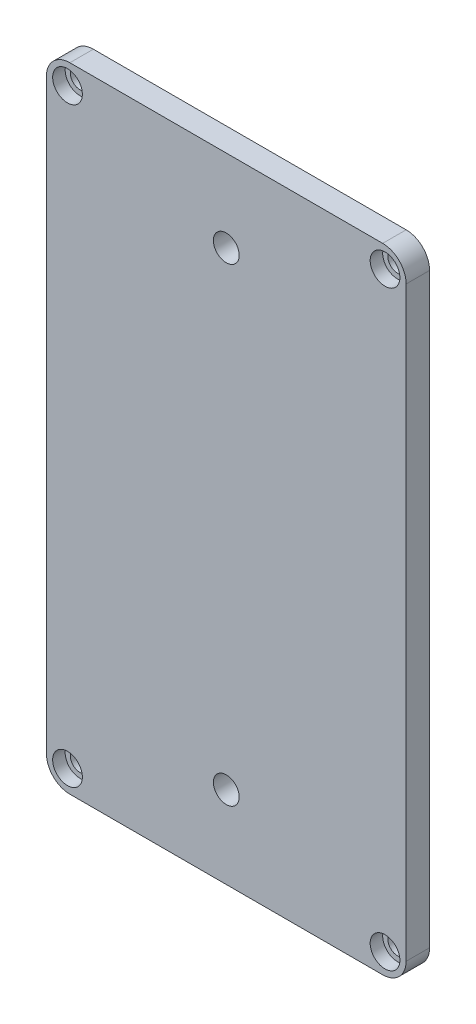
ISO-10303-21;
HEADER;
FILE_DESCRIPTION(('STEP AP214'),'2;1');
FILE_NAME('part.step','',(''),(''),'','','');
FILE_SCHEMA(('AUTOMOTIVE_DESIGN { 1 0 10303 214 1 1 1 1 }'));
ENDSEC;
DATA;
#1=APPLICATION_CONTEXT('core data for automotive mechanical design processes');
#2=APPLICATION_PROTOCOL_DEFINITION('international standard','automotive_design',2000,#1);
#3=PRODUCT_CONTEXT('',#1,'mechanical');
#4=PRODUCT('Part','Part','',(#3));
#5=PRODUCT_RELATED_PRODUCT_CATEGORY('part','',(#4));
#6=PRODUCT_DEFINITION_FORMATION('','',#4);
#7=PRODUCT_DEFINITION_CONTEXT('part definition',#1,'design');
#8=PRODUCT_DEFINITION('design','',#6,#7);
#9=PRODUCT_DEFINITION_SHAPE('','',#8);
#10=(LENGTH_UNIT() NAMED_UNIT(*) SI_UNIT(.MILLI.,.METRE.));
#11=(NAMED_UNIT(*) PLANE_ANGLE_UNIT() SI_UNIT($,.RADIAN.));
#12=(NAMED_UNIT(*) SI_UNIT($,.STERADIAN.) SOLID_ANGLE_UNIT());
#13=UNCERTAINTY_MEASURE_WITH_UNIT(LENGTH_MEASURE(1.E-05),#10,'distance_accuracy_value','');
#14=(GEOMETRIC_REPRESENTATION_CONTEXT(3) GLOBAL_UNCERTAINTY_ASSIGNED_CONTEXT((#13)) GLOBAL_UNIT_ASSIGNED_CONTEXT((#10,
#11,#12)) REPRESENTATION_CONTEXT('',''));
#15=CARTESIAN_POINT('',(0.,0.,0.));
#16=DIRECTION('',(0.,0.,1.));
#17=DIRECTION('',(1.,0.,0.));
#18=AXIS2_PLACEMENT_3D('',#15,#16,#17);
#19=CARTESIAN_POINT('',(20.3,37.8,3.));
#20=DIRECTION('',(0.,0.,-1.));
#21=DIRECTION('',(-1.,0.,0.));
#22=AXIS2_PLACEMENT_3D('',#19,#20,#21);
#23=CYLINDRICAL_SURFACE('',#22,1.25);
#24=CARTESIAN_POINT('',(20.3,37.8,0.));
#25=DIRECTION('',(0.,0.,1.));
#26=DIRECTION('',(-1.,0.,0.));
#27=AXIS2_PLACEMENT_3D('',#24,#25,#26);
#28=CIRCLE('',#27,1.25);
#29=CARTESIAN_POINT('',(19.05,37.8,0.));
#30=VERTEX_POINT('',#29);
#31=EDGE_CURVE('E140',#30,#30,#28,.T.);
#32=ORIENTED_EDGE('',*,*,#31,.F.);
#33=EDGE_LOOP('',(#32));
#34=FACE_BOUND('',#33,.T.);
#35=CARTESIAN_POINT('',(20.3,37.8,1.4));
#36=DIRECTION('',(0.,0.,1.));
#37=DIRECTION('',(1.,0.,0.));
#38=AXIS2_PLACEMENT_3D('',#35,#36,#37);
#39=CIRCLE('',#38,1.25);
#40=CARTESIAN_POINT('',(21.55,37.8,1.4));
#41=VERTEX_POINT('',#40);
#42=EDGE_CURVE('E175',#41,#41,#39,.T.);
#43=ORIENTED_EDGE('',*,*,#42,.T.);
#44=EDGE_LOOP('',(#43));
#45=FACE_BOUND('',#44,.T.);
#46=ADVANCED_FACE('F36',(#34,#45),#23,.F.);
#47=CARTESIAN_POINT('',(-20.3,-37.8,3.));
#48=DIRECTION('',(0.,0.,-1.));
#49=DIRECTION('',(-1.,0.,0.));
#50=AXIS2_PLACEMENT_3D('',#47,#48,#49);
#51=CYLINDRICAL_SURFACE('',#50,1.25);
#52=CARTESIAN_POINT('',(-20.3,-37.8,0.));
#53=DIRECTION('',(0.,0.,1.));
#54=DIRECTION('',(-1.,0.,0.));
#55=AXIS2_PLACEMENT_3D('',#52,#53,#54);
#56=CIRCLE('',#55,1.25);
#57=CARTESIAN_POINT('',(-21.55,-37.8,0.));
#58=VERTEX_POINT('',#57);
#59=EDGE_CURVE('E180',#58,#58,#56,.T.);
#60=ORIENTED_EDGE('',*,*,#59,.F.);
#61=EDGE_LOOP('',(#60));
#62=FACE_BOUND('',#61,.T.);
#63=CARTESIAN_POINT('',(-20.3,-37.8,1.4));
#64=DIRECTION('',(0.,0.,1.));
#65=DIRECTION('',(1.,0.,0.));
#66=AXIS2_PLACEMENT_3D('',#63,#64,#65);
#67=CIRCLE('',#66,1.25);
#68=CARTESIAN_POINT('',(-19.05,-37.8,1.4));
#69=VERTEX_POINT('',#68);
#70=EDGE_CURVE('E168',#69,#69,#67,.T.);
#71=ORIENTED_EDGE('',*,*,#70,.T.);
#72=EDGE_LOOP('',(#71));
#73=FACE_BOUND('',#72,.T.);
#74=ADVANCED_FACE('F257',(#62,#73),#51,.F.);
#75=CARTESIAN_POINT('',(0.,0.,3.));
#76=DIRECTION('',(0.,0.,-1.));
#77=DIRECTION('',(-1.,0.,0.));
#78=AXIS2_PLACEMENT_3D('',#75,#76,#77);
#79=PLANE('',#78);
#80=CARTESIAN_POINT('',(0.,30.,3.));
#81=DIRECTION('',(0.,0.,1.));
#82=DIRECTION('',(1.,0.,0.));
#83=AXIS2_PLACEMENT_3D('',#80,#81,#82);
#84=CIRCLE('',#83,1.65);
#85=CARTESIAN_POINT('',(1.65,30.,3.));
#86=VERTEX_POINT('',#85);
#87=EDGE_CURVE('E183',#86,#86,#84,.T.);
#88=ORIENTED_EDGE('',*,*,#87,.F.);
#89=EDGE_LOOP('',(#88));
#90=FACE_BOUND('',#89,.T.);
#91=CARTESIAN_POINT('',(0.,-30.,3.));
#92=DIRECTION('',(0.,0.,1.));
#93=DIRECTION('',(-1.,0.,0.));
#94=AXIS2_PLACEMENT_3D('',#91,#92,#93);
#95=CIRCLE('',#94,1.65);
#96=CARTESIAN_POINT('',(-1.64999999999999,-30.,3.));
#97=VERTEX_POINT('',#96);
#98=EDGE_CURVE('E189',#97,#97,#95,.T.);
#99=ORIENTED_EDGE('',*,*,#98,.F.);
#100=EDGE_LOOP('',(#99));
#101=FACE_BOUND('',#100,.T.);
#102=CARTESIAN_POINT('',(20.3,-37.8,3.));
#103=DIRECTION('',(0.,0.,1.));
#104=DIRECTION('',(-1.,0.,0.));
#105=AXIS2_PLACEMENT_3D('',#102,#103,#104);
#106=CIRCLE('',#105,1.9);
#107=CARTESIAN_POINT('',(18.4,-37.8,3.));
#108=VERTEX_POINT('',#107);
#109=EDGE_CURVE('E187',#108,#108,#106,.T.);
#110=ORIENTED_EDGE('',*,*,#109,.F.);
#111=EDGE_LOOP('',(#110));
#112=FACE_BOUND('',#111,.T.);
#113=CARTESIAN_POINT('',(-20.3,-37.8,3.));
#114=DIRECTION('',(0.,0.,1.));
#115=DIRECTION('',(1.,0.,0.));
#116=AXIS2_PLACEMENT_3D('',#113,#114,#115);
#117=CIRCLE('',#116,1.9);
#118=CARTESIAN_POINT('',(-18.4,-37.8,3.));
#119=VERTEX_POINT('',#118);
#120=EDGE_CURVE('E206',#119,#119,#117,.T.);
#121=ORIENTED_EDGE('',*,*,#120,.F.);
#122=EDGE_LOOP('',(#121));
#123=FACE_BOUND('',#122,.T.);
#124=CARTESIAN_POINT('',(-20.3,37.8,3.));
#125=DIRECTION('',(0.,0.,1.));
#126=DIRECTION('',(-1.,0.,0.));
#127=AXIS2_PLACEMENT_3D('',#124,#125,#126);
#128=CIRCLE('',#127,1.9);
#129=CARTESIAN_POINT('',(-22.2,37.8,3.));
#130=VERTEX_POINT('',#129);
#131=EDGE_CURVE('E200',#130,#130,#128,.T.);
#132=ORIENTED_EDGE('',*,*,#131,.F.);
#133=EDGE_LOOP('',(#132));
#134=FACE_BOUND('',#133,.T.);
#135=CARTESIAN_POINT('',(20.3,37.8,3.));
#136=DIRECTION('',(0.,0.,1.));
#137=DIRECTION('',(1.,0.,0.));
#138=AXIS2_PLACEMENT_3D('',#135,#136,#137);
#139=CIRCLE('',#138,1.9);
#140=CARTESIAN_POINT('',(22.2,37.8,3.));
#141=VERTEX_POINT('',#140);
#142=EDGE_CURVE('E199',#141,#141,#139,.T.);
#143=ORIENTED_EDGE('',*,*,#142,.F.);
#144=EDGE_LOOP('',(#143));
#145=FACE_BOUND('',#144,.T.);
#146=DIRECTION('',(1.,0.,0.));
#147=VECTOR('',#146,1.);
#148=CARTESIAN_POINT('',(-23.,-40.5,3.));
#149=LINE('',#148,#147);
#150=CARTESIAN_POINT('',(-20.,-40.5,3.));
#151=VERTEX_POINT('',#150);
#152=CARTESIAN_POINT('',(20.,-40.5,3.));
#153=VERTEX_POINT('',#152);
#154=EDGE_CURVE('E143',#151,#153,#149,.T.);
#155=ORIENTED_EDGE('',*,*,#154,.T.);
#156=CARTESIAN_POINT('',(20.,-37.5,3.));
#157=DIRECTION('',(0.,0.,-1.));
#158=DIRECTION('',(-1.,0.,0.));
#159=AXIS2_PLACEMENT_3D('',#156,#157,#158);
#160=CIRCLE('',#159,3.);
#161=CARTESIAN_POINT('',(23.,-37.5,3.));
#162=VERTEX_POINT('',#161);
#163=EDGE_CURVE('E161',#153,#162,#160,.F.);
#164=ORIENTED_EDGE('',*,*,#163,.T.);
#165=DIRECTION('',(0.,1.,0.));
#166=VECTOR('',#165,1.);
#167=CARTESIAN_POINT('',(23.,-40.5,3.));
#168=LINE('',#167,#166);
#169=CARTESIAN_POINT('',(23.,37.5,3.));
#170=VERTEX_POINT('',#169);
#171=EDGE_CURVE('E125',#162,#170,#168,.T.);
#172=ORIENTED_EDGE('',*,*,#171,.T.);
#173=CARTESIAN_POINT('',(20.,37.5,3.));
#174=DIRECTION('',(0.,0.,-1.));
#175=DIRECTION('',(-1.,0.,0.));
#176=AXIS2_PLACEMENT_3D('',#173,#174,#175);
#177=CIRCLE('',#176,3.);
#178=CARTESIAN_POINT('',(20.,40.5,3.));
#179=VERTEX_POINT('',#178);
#180=EDGE_CURVE('E157',#170,#179,#177,.F.);
#181=ORIENTED_EDGE('',*,*,#180,.T.);
#182=DIRECTION('',(-1.,0.,0.));
#183=VECTOR('',#182,1.);
#184=CARTESIAN_POINT('',(-23.,40.5,3.));
#185=LINE('',#184,#183);
#186=CARTESIAN_POINT('',(-20.,40.5,3.));
#187=VERTEX_POINT('',#186);
#188=EDGE_CURVE('E226',#179,#187,#185,.T.);
#189=ORIENTED_EDGE('',*,*,#188,.T.);
#190=CARTESIAN_POINT('',(-20.,37.5,3.));
#191=DIRECTION('',(0.,0.,-1.));
#192=DIRECTION('',(-1.,0.,0.));
#193=AXIS2_PLACEMENT_3D('',#190,#191,#192);
#194=CIRCLE('',#193,3.);
#195=CARTESIAN_POINT('',(-23.,37.5,3.));
#196=VERTEX_POINT('',#195);
#197=EDGE_CURVE('E60',#187,#196,#194,.F.);
#198=ORIENTED_EDGE('',*,*,#197,.T.);
#199=DIRECTION('',(0.,-1.,0.));
#200=VECTOR('',#199,1.);
#201=CARTESIAN_POINT('',(-23.,-40.5,3.));
#202=LINE('',#201,#200);
#203=CARTESIAN_POINT('',(-23.,-37.5,3.));
#204=VERTEX_POINT('',#203);
#205=EDGE_CURVE('E227',#196,#204,#202,.T.);
#206=ORIENTED_EDGE('',*,*,#205,.T.);
#207=CARTESIAN_POINT('',(-20.,-37.5,3.));
#208=DIRECTION('',(0.,0.,-1.));
#209=DIRECTION('',(-1.,0.,0.));
#210=AXIS2_PLACEMENT_3D('',#207,#208,#209);
#211=CIRCLE('',#210,3.);
#212=EDGE_CURVE('E159',#204,#151,#211,.F.);
#213=ORIENTED_EDGE('',*,*,#212,.T.);
#214=EDGE_LOOP('',(#155,#164,#172,#181,#189,#198,#206,#213));
#215=FACE_BOUND('',#214,.T.);
#216=ADVANCED_FACE('F231',(#90,#101,#112,#123,#134,#145,#215),#79,.F.);
#217=CARTESIAN_POINT('',(0.,0.,0.));
#218=DIRECTION('',(0.,0.,-1.));
#219=DIRECTION('',(-1.,0.,0.));
#220=AXIS2_PLACEMENT_3D('',#217,#218,#219);
#221=PLANE('',#220);
#222=CARTESIAN_POINT('',(0.,30.,0.));
#223=DIRECTION('',(0.,0.,-1.));
#224=DIRECTION('',(-1.,0.,0.));
#225=AXIS2_PLACEMENT_3D('',#222,#223,#224);
#226=CIRCLE('',#225,1.65);
#227=CARTESIAN_POINT('',(-1.65,30.,0.));
#228=VERTEX_POINT('',#227);
#229=EDGE_CURVE('E40',#228,#228,#226,.T.);
#230=ORIENTED_EDGE('',*,*,#229,.F.);
#231=EDGE_LOOP('',(#230));
#232=FACE_BOUND('',#231,.T.);
#233=CARTESIAN_POINT('',(0.,-30.,0.));
#234=DIRECTION('',(0.,0.,-1.));
#235=DIRECTION('',(-1.,0.,0.));
#236=AXIS2_PLACEMENT_3D('',#233,#234,#235);
#237=CIRCLE('',#236,1.65);
#238=CARTESIAN_POINT('',(-1.64999999999999,-30.,0.));
#239=VERTEX_POINT('',#238);
#240=EDGE_CURVE('E181',#239,#239,#237,.T.);
#241=ORIENTED_EDGE('',*,*,#240,.F.);
#242=EDGE_LOOP('',(#241));
#243=FACE_BOUND('',#242,.T.);
#244=CARTESIAN_POINT('',(20.3,-37.8,0.));
#245=DIRECTION('',(0.,0.,1.));
#246=DIRECTION('',(1.,0.,0.));
#247=AXIS2_PLACEMENT_3D('',#244,#245,#246);
#248=CIRCLE('',#247,1.25);
#249=CARTESIAN_POINT('',(21.55,-37.8,0.));
#250=VERTEX_POINT('',#249);
#251=EDGE_CURVE('E220',#250,#250,#248,.T.);
#252=ORIENTED_EDGE('',*,*,#251,.T.);
#253=EDGE_LOOP('',(#252));
#254=FACE_BOUND('',#253,.T.);
#255=CARTESIAN_POINT('',(-20.3,37.8,0.));
#256=DIRECTION('',(0.,0.,1.));
#257=DIRECTION('',(1.,0.,0.));
#258=AXIS2_PLACEMENT_3D('',#255,#256,#257);
#259=CIRCLE('',#258,1.25);
#260=CARTESIAN_POINT('',(-19.05,37.8,0.));
#261=VERTEX_POINT('',#260);
#262=EDGE_CURVE('E134',#261,#261,#259,.T.);
#263=ORIENTED_EDGE('',*,*,#262,.T.);
#264=EDGE_LOOP('',(#263));
#265=FACE_BOUND('',#264,.T.);
#266=DIRECTION('',(0.,1.,0.));
#267=VECTOR('',#266,1.);
#268=CARTESIAN_POINT('',(23.,-40.5,0.));
#269=LINE('',#268,#267);
#270=CARTESIAN_POINT('',(23.,-37.5,0.));
#271=VERTEX_POINT('',#270);
#272=CARTESIAN_POINT('',(23.,37.5,0.));
#273=VERTEX_POINT('',#272);
#274=EDGE_CURVE('E122',#271,#273,#269,.T.);
#275=ORIENTED_EDGE('',*,*,#274,.F.);
#276=CARTESIAN_POINT('',(20.,-37.5,0.));
#277=DIRECTION('',(0.,0.,-1.));
#278=DIRECTION('',(-1.,0.,0.));
#279=AXIS2_PLACEMENT_3D('',#276,#277,#278);
#280=CIRCLE('',#279,3.);
#281=CARTESIAN_POINT('',(20.,-40.5,0.));
#282=VERTEX_POINT('',#281);
#283=EDGE_CURVE('E105',#271,#282,#280,.T.);
#284=ORIENTED_EDGE('',*,*,#283,.T.);
#285=DIRECTION('',(1.,0.,0.));
#286=VECTOR('',#285,1.);
#287=CARTESIAN_POINT('',(-23.,-40.5,0.));
#288=LINE('',#287,#286);
#289=CARTESIAN_POINT('',(-20.,-40.5,0.));
#290=VERTEX_POINT('',#289);
#291=EDGE_CURVE('E147',#290,#282,#288,.T.);
#292=ORIENTED_EDGE('',*,*,#291,.F.);
#293=CARTESIAN_POINT('',(-20.,-37.5,0.));
#294=DIRECTION('',(0.,0.,-1.));
#295=DIRECTION('',(-1.,0.,0.));
#296=AXIS2_PLACEMENT_3D('',#293,#294,#295);
#297=CIRCLE('',#296,3.);
#298=CARTESIAN_POINT('',(-23.,-37.5,0.));
#299=VERTEX_POINT('',#298);
#300=EDGE_CURVE('E116',#290,#299,#297,.T.);
#301=ORIENTED_EDGE('',*,*,#300,.T.);
#302=DIRECTION('',(0.,-1.,0.));
#303=VECTOR('',#302,1.);
#304=CARTESIAN_POINT('',(-23.,-40.5,0.));
#305=LINE('',#304,#303);
#306=CARTESIAN_POINT('',(-23.,37.5,0.));
#307=VERTEX_POINT('',#306);
#308=EDGE_CURVE('E137',#307,#299,#305,.T.);
#309=ORIENTED_EDGE('',*,*,#308,.F.);
#310=CARTESIAN_POINT('',(-20.,37.5,0.));
#311=DIRECTION('',(0.,0.,-1.));
#312=DIRECTION('',(-1.,0.,0.));
#313=AXIS2_PLACEMENT_3D('',#310,#311,#312);
#314=CIRCLE('',#313,3.);
#315=CARTESIAN_POINT('',(-20.,40.5,0.));
#316=VERTEX_POINT('',#315);
#317=EDGE_CURVE('E126',#307,#316,#314,.T.);
#318=ORIENTED_EDGE('',*,*,#317,.T.);
#319=DIRECTION('',(-1.,0.,0.));
#320=VECTOR('',#319,1.);
#321=CARTESIAN_POINT('',(-23.,40.5,0.));
#322=LINE('',#321,#320);
#323=CARTESIAN_POINT('',(20.,40.5,0.));
#324=VERTEX_POINT('',#323);
#325=EDGE_CURVE('E133',#324,#316,#322,.T.);
#326=ORIENTED_EDGE('',*,*,#325,.F.);
#327=CARTESIAN_POINT('',(20.,37.5,0.));
#328=DIRECTION('',(0.,0.,-1.));
#329=DIRECTION('',(-1.,0.,0.));
#330=AXIS2_PLACEMENT_3D('',#327,#328,#329);
#331=CIRCLE('',#330,3.);
#332=EDGE_CURVE('E132',#324,#273,#331,.T.);
#333=ORIENTED_EDGE('',*,*,#332,.T.);
#334=EDGE_LOOP('',(#275,#284,#292,#301,#309,#318,#326,#333));
#335=FACE_BOUND('',#334,.T.);
#336=ORIENTED_EDGE('',*,*,#31,.T.);
#337=EDGE_LOOP('',(#336));
#338=FACE_BOUND('',#337,.T.);
#339=ORIENTED_EDGE('',*,*,#59,.T.);
#340=EDGE_LOOP('',(#339));
#341=FACE_BOUND('',#340,.T.);
#342=ADVANCED_FACE('F129',(#232,#243,#254,#265,#335,#338,#341),#221,.T.);
#343=CARTESIAN_POINT('',(23.,-40.5,3.));
#344=DIRECTION('',(-1.,0.,0.));
#345=DIRECTION('',(0.,0.,1.));
#346=AXIS2_PLACEMENT_3D('',#343,#344,#345);
#347=PLANE('',#346);
#348=ORIENTED_EDGE('',*,*,#171,.F.);
#349=DIRECTION('',(0.,0.,-1.));
#350=VECTOR('',#349,1.);
#351=CARTESIAN_POINT('',(23.,-37.5,3.));
#352=LINE('',#351,#350);
#353=EDGE_CURVE('E109',#162,#271,#352,.T.);
#354=ORIENTED_EDGE('',*,*,#353,.T.);
#355=ORIENTED_EDGE('',*,*,#274,.T.);
#356=DIRECTION('',(0.,0.,-1.));
#357=VECTOR('',#356,1.);
#358=CARTESIAN_POINT('',(23.,37.5,3.));
#359=LINE('',#358,#357);
#360=EDGE_CURVE('E127',#273,#170,#359,.F.);
#361=ORIENTED_EDGE('',*,*,#360,.T.);
#362=EDGE_LOOP('',(#348,#354,#355,#361));
#363=FACE_BOUND('',#362,.T.);
#364=ADVANCED_FACE('F121',(#363),#347,.F.);
#365=CARTESIAN_POINT('',(-23.,40.5,3.));
#366=DIRECTION('',(0.,-1.,0.));
#367=DIRECTION('',(0.,0.,-1.));
#368=AXIS2_PLACEMENT_3D('',#365,#366,#367);
#369=PLANE('',#368);
#370=ORIENTED_EDGE('',*,*,#188,.F.);
#371=DIRECTION('',(0.,0.,-1.));
#372=VECTOR('',#371,1.);
#373=CARTESIAN_POINT('',(20.,40.5,3.));
#374=LINE('',#373,#372);
#375=EDGE_CURVE('E11',#179,#324,#374,.T.);
#376=ORIENTED_EDGE('',*,*,#375,.T.);
#377=ORIENTED_EDGE('',*,*,#325,.T.);
#378=DIRECTION('',(0.,0.,-1.));
#379=VECTOR('',#378,1.);
#380=CARTESIAN_POINT('',(-20.,40.5,3.));
#381=LINE('',#380,#379);
#382=EDGE_CURVE('E45',#316,#187,#381,.F.);
#383=ORIENTED_EDGE('',*,*,#382,.T.);
#384=EDGE_LOOP('',(#370,#376,#377,#383));
#385=FACE_BOUND('',#384,.T.);
#386=ADVANCED_FACE('F244',(#385),#369,.F.);
#387=CARTESIAN_POINT('',(-23.,-40.5,3.));
#388=DIRECTION('',(1.,0.,0.));
#389=DIRECTION('',(0.,0.,-1.));
#390=AXIS2_PLACEMENT_3D('',#387,#388,#389);
#391=PLANE('',#390);
#392=ORIENTED_EDGE('',*,*,#308,.T.);
#393=DIRECTION('',(0.,0.,-1.));
#394=VECTOR('',#393,1.);
#395=CARTESIAN_POINT('',(-23.,-37.5,3.));
#396=LINE('',#395,#394);
#397=EDGE_CURVE('E53',#299,#204,#396,.F.);
#398=ORIENTED_EDGE('',*,*,#397,.T.);
#399=ORIENTED_EDGE('',*,*,#205,.F.);
#400=DIRECTION('',(0.,0.,-1.));
#401=VECTOR('',#400,1.);
#402=CARTESIAN_POINT('',(-23.,37.5,3.));
#403=LINE('',#402,#401);
#404=EDGE_CURVE('E163',#196,#307,#403,.T.);
#405=ORIENTED_EDGE('',*,*,#404,.T.);
#406=EDGE_LOOP('',(#392,#398,#399,#405));
#407=FACE_BOUND('',#406,.T.);
#408=ADVANCED_FACE('F238',(#407),#391,.F.);
#409=CARTESIAN_POINT('',(-23.,-40.5,3.));
#410=DIRECTION('',(0.,1.,0.));
#411=DIRECTION('',(0.,0.,1.));
#412=AXIS2_PLACEMENT_3D('',#409,#410,#411);
#413=PLANE('',#412);
#414=ORIENTED_EDGE('',*,*,#291,.T.);
#415=DIRECTION('',(0.,0.,-1.));
#416=VECTOR('',#415,1.);
#417=CARTESIAN_POINT('',(20.,-40.5,3.));
#418=LINE('',#417,#416);
#419=EDGE_CURVE('E110',#282,#153,#418,.F.);
#420=ORIENTED_EDGE('',*,*,#419,.T.);
#421=ORIENTED_EDGE('',*,*,#154,.F.);
#422=DIRECTION('',(0.,0.,-1.));
#423=VECTOR('',#422,1.);
#424=CARTESIAN_POINT('',(-20.,-40.5,3.));
#425=LINE('',#424,#423);
#426=EDGE_CURVE('E115',#151,#290,#425,.T.);
#427=ORIENTED_EDGE('',*,*,#426,.T.);
#428=EDGE_LOOP('',(#414,#420,#421,#427));
#429=FACE_BOUND('',#428,.T.);
#430=ADVANCED_FACE('F234',(#429),#413,.F.);
#431=CARTESIAN_POINT('',(-20.3,37.8,3.));
#432=DIRECTION('',(0.,0.,-1.));
#433=DIRECTION('',(-1.,0.,0.));
#434=AXIS2_PLACEMENT_3D('',#431,#432,#433);
#435=CYLINDRICAL_SURFACE('',#434,1.25);
#436=CARTESIAN_POINT('',(-20.3,37.8,1.4));
#437=DIRECTION('',(0.,0.,-1.));
#438=DIRECTION('',(-1.,0.,0.));
#439=AXIS2_PLACEMENT_3D('',#436,#437,#438);
#440=CIRCLE('',#439,1.25);
#441=CARTESIAN_POINT('',(-21.55,37.8,1.4));
#442=VERTEX_POINT('',#441);
#443=EDGE_CURVE('E178',#442,#442,#440,.T.);
#444=ORIENTED_EDGE('',*,*,#443,.F.);
#445=EDGE_LOOP('',(#444));
#446=FACE_BOUND('',#445,.T.);
#447=ORIENTED_EDGE('',*,*,#262,.F.);
#448=EDGE_LOOP('',(#447));
#449=FACE_BOUND('',#448,.T.);
#450=ADVANCED_FACE('F270',(#446,#449),#435,.F.);
#451=CARTESIAN_POINT('',(20.3,-37.8,3.));
#452=DIRECTION('',(0.,0.,-1.));
#453=DIRECTION('',(-1.,0.,0.));
#454=AXIS2_PLACEMENT_3D('',#451,#452,#453);
#455=CYLINDRICAL_SURFACE('',#454,1.25);
#456=CARTESIAN_POINT('',(20.3,-37.8,1.4));
#457=DIRECTION('',(0.,0.,-1.));
#458=DIRECTION('',(-1.,0.,0.));
#459=AXIS2_PLACEMENT_3D('',#456,#457,#458);
#460=CIRCLE('',#459,1.25);
#461=CARTESIAN_POINT('',(19.05,-37.8,1.4));
#462=VERTEX_POINT('',#461);
#463=EDGE_CURVE('E171',#462,#462,#460,.T.);
#464=ORIENTED_EDGE('',*,*,#463,.F.);
#465=EDGE_LOOP('',(#464));
#466=FACE_BOUND('',#465,.T.);
#467=ORIENTED_EDGE('',*,*,#251,.F.);
#468=EDGE_LOOP('',(#467));
#469=FACE_BOUND('',#468,.T.);
#470=ADVANCED_FACE('F269',(#466,#469),#455,.F.);
#471=CARTESIAN_POINT('',(20.,-37.5,3.));
#472=DIRECTION('',(0.,0.,-1.));
#473=DIRECTION('',(-1.,0.,0.));
#474=AXIS2_PLACEMENT_3D('',#471,#472,#473);
#475=CYLINDRICAL_SURFACE('',#474,3.);
#476=ORIENTED_EDGE('',*,*,#163,.F.);
#477=ORIENTED_EDGE('',*,*,#419,.F.);
#478=ORIENTED_EDGE('',*,*,#283,.F.);
#479=ORIENTED_EDGE('',*,*,#353,.F.);
#480=EDGE_LOOP('',(#476,#477,#478,#479));
#481=FACE_BOUND('',#480,.T.);
#482=ADVANCED_FACE('F108',(#481),#475,.T.);
#483=CARTESIAN_POINT('',(-20.,-37.5,3.));
#484=DIRECTION('',(0.,0.,-1.));
#485=DIRECTION('',(-1.,0.,0.));
#486=AXIS2_PLACEMENT_3D('',#483,#484,#485);
#487=CYLINDRICAL_SURFACE('',#486,3.);
#488=ORIENTED_EDGE('',*,*,#212,.F.);
#489=ORIENTED_EDGE('',*,*,#397,.F.);
#490=ORIENTED_EDGE('',*,*,#300,.F.);
#491=ORIENTED_EDGE('',*,*,#426,.F.);
#492=EDGE_LOOP('',(#488,#489,#490,#491));
#493=FACE_BOUND('',#492,.T.);
#494=ADVANCED_FACE('F236',(#493),#487,.T.);
#495=CARTESIAN_POINT('',(20.,37.5,3.));
#496=DIRECTION('',(0.,0.,-1.));
#497=DIRECTION('',(-1.,0.,0.));
#498=AXIS2_PLACEMENT_3D('',#495,#496,#497);
#499=CYLINDRICAL_SURFACE('',#498,3.);
#500=ORIENTED_EDGE('',*,*,#180,.F.);
#501=ORIENTED_EDGE('',*,*,#360,.F.);
#502=ORIENTED_EDGE('',*,*,#332,.F.);
#503=ORIENTED_EDGE('',*,*,#375,.F.);
#504=EDGE_LOOP('',(#500,#501,#502,#503));
#505=FACE_BOUND('',#504,.T.);
#506=ADVANCED_FACE('F248',(#505),#499,.T.);
#507=CARTESIAN_POINT('',(-20.,37.5,3.));
#508=DIRECTION('',(0.,0.,-1.));
#509=DIRECTION('',(-1.,0.,0.));
#510=AXIS2_PLACEMENT_3D('',#507,#508,#509);
#511=CYLINDRICAL_SURFACE('',#510,3.);
#512=ORIENTED_EDGE('',*,*,#197,.F.);
#513=ORIENTED_EDGE('',*,*,#382,.F.);
#514=ORIENTED_EDGE('',*,*,#317,.F.);
#515=ORIENTED_EDGE('',*,*,#404,.F.);
#516=EDGE_LOOP('',(#512,#513,#514,#515));
#517=FACE_BOUND('',#516,.T.);
#518=ADVANCED_FACE('F38',(#517),#511,.T.);
#519=CARTESIAN_POINT('',(-20.3,-37.8,1.4));
#520=DIRECTION('',(0.,0.,1.));
#521=DIRECTION('',(1.,0.,0.));
#522=AXIS2_PLACEMENT_3D('',#519,#520,#521);
#523=CYLINDRICAL_SURFACE('',#522,1.9);
#524=CARTESIAN_POINT('',(-20.3,-37.8,1.4));
#525=DIRECTION('',(0.,0.,1.));
#526=DIRECTION('',(1.,0.,0.));
#527=AXIS2_PLACEMENT_3D('',#524,#525,#526);
#528=CIRCLE('',#527,1.9);
#529=CARTESIAN_POINT('',(-18.4,-37.8,1.4));
#530=VERTEX_POINT('',#529);
#531=EDGE_CURVE('E203',#530,#530,#528,.T.);
#532=ORIENTED_EDGE('',*,*,#531,.F.);
#533=EDGE_LOOP('',(#532));
#534=FACE_BOUND('',#533,.T.);
#535=ORIENTED_EDGE('',*,*,#120,.T.);
#536=EDGE_LOOP('',(#535));
#537=FACE_BOUND('',#536,.T.);
#538=ADVANCED_FACE('F254',(#534,#537),#523,.F.);
#539=CARTESIAN_POINT('',(-20.3,-37.8,1.4));
#540=DIRECTION('',(0.,0.,1.));
#541=DIRECTION('',(1.,0.,0.));
#542=AXIS2_PLACEMENT_3D('',#539,#540,#541);
#543=PLANE('',#542);
#544=ORIENTED_EDGE('',*,*,#70,.F.);
#545=EDGE_LOOP('',(#544));
#546=FACE_BOUND('',#545,.T.);
#547=ORIENTED_EDGE('',*,*,#531,.T.);
#548=EDGE_LOOP('',(#547));
#549=FACE_BOUND('',#548,.T.);
#550=ADVANCED_FACE('F313',(#546,#549),#543,.T.);
#551=CARTESIAN_POINT('',(20.3,-37.8,1.4));
#552=DIRECTION('',(0.,0.,1.));
#553=DIRECTION('',(1.,0.,0.));
#554=AXIS2_PLACEMENT_3D('',#551,#552,#553);
#555=CYLINDRICAL_SURFACE('',#554,1.9);
#556=CARTESIAN_POINT('',(20.3,-37.8,1.4));
#557=DIRECTION('',(0.,0.,1.));
#558=DIRECTION('',(-1.,0.,0.));
#559=AXIS2_PLACEMENT_3D('',#556,#557,#558);
#560=CIRCLE('',#559,1.9);
#561=CARTESIAN_POINT('',(18.4,-37.8,1.4));
#562=VERTEX_POINT('',#561);
#563=EDGE_CURVE('E209',#562,#562,#560,.T.);
#564=ORIENTED_EDGE('',*,*,#563,.F.);
#565=EDGE_LOOP('',(#564));
#566=FACE_BOUND('',#565,.T.);
#567=ORIENTED_EDGE('',*,*,#109,.T.);
#568=EDGE_LOOP('',(#567));
#569=FACE_BOUND('',#568,.T.);
#570=ADVANCED_FACE('F307',(#566,#569),#555,.F.);
#571=CARTESIAN_POINT('',(20.3,-37.8,1.4));
#572=DIRECTION('',(0.,0.,-1.));
#573=DIRECTION('',(-1.,0.,0.));
#574=AXIS2_PLACEMENT_3D('',#571,#572,#573);
#575=PLANE('',#574);
#576=ORIENTED_EDGE('',*,*,#463,.T.);
#577=EDGE_LOOP('',(#576));
#578=FACE_BOUND('',#577,.T.);
#579=ORIENTED_EDGE('',*,*,#563,.T.);
#580=EDGE_LOOP('',(#579));
#581=FACE_BOUND('',#580,.T.);
#582=ADVANCED_FACE('F303',(#578,#581),#575,.F.);
#583=CARTESIAN_POINT('',(20.3,37.8,1.4));
#584=DIRECTION('',(0.,0.,1.));
#585=DIRECTION('',(1.,0.,0.));
#586=AXIS2_PLACEMENT_3D('',#583,#584,#585);
#587=CYLINDRICAL_SURFACE('',#586,1.9);
#588=CARTESIAN_POINT('',(20.3,37.8,1.4));
#589=DIRECTION('',(0.,0.,1.));
#590=DIRECTION('',(1.,0.,0.));
#591=AXIS2_PLACEMENT_3D('',#588,#589,#590);
#592=CIRCLE('',#591,1.9);
#593=CARTESIAN_POINT('',(22.2,37.8,1.4));
#594=VERTEX_POINT('',#593);
#595=EDGE_CURVE('E172',#594,#594,#592,.T.);
#596=ORIENTED_EDGE('',*,*,#595,.F.);
#597=EDGE_LOOP('',(#596));
#598=FACE_BOUND('',#597,.T.);
#599=ORIENTED_EDGE('',*,*,#142,.T.);
#600=EDGE_LOOP('',(#599));
#601=FACE_BOUND('',#600,.T.);
#602=ADVANCED_FACE('F306',(#598,#601),#587,.F.);
#603=CARTESIAN_POINT('',(20.3,37.8,1.4));
#604=DIRECTION('',(0.,0.,1.));
#605=DIRECTION('',(1.,0.,0.));
#606=AXIS2_PLACEMENT_3D('',#603,#604,#605);
#607=PLANE('',#606);
#608=ORIENTED_EDGE('',*,*,#42,.F.);
#609=EDGE_LOOP('',(#608));
#610=FACE_BOUND('',#609,.T.);
#611=ORIENTED_EDGE('',*,*,#595,.T.);
#612=EDGE_LOOP('',(#611));
#613=FACE_BOUND('',#612,.T.);
#614=ADVANCED_FACE('F325',(#610,#613),#607,.T.);
#615=CARTESIAN_POINT('',(-20.3,37.8,1.4));
#616=DIRECTION('',(0.,0.,1.));
#617=DIRECTION('',(1.,0.,0.));
#618=AXIS2_PLACEMENT_3D('',#615,#616,#617);
#619=CYLINDRICAL_SURFACE('',#618,1.9);
#620=CARTESIAN_POINT('',(-20.3,37.8,1.4));
#621=DIRECTION('',(0.,0.,1.));
#622=DIRECTION('',(-1.,0.,0.));
#623=AXIS2_PLACEMENT_3D('',#620,#621,#622);
#624=CIRCLE('',#623,1.9);
#625=CARTESIAN_POINT('',(-22.2,37.8,1.4));
#626=VERTEX_POINT('',#625);
#627=EDGE_CURVE('E196',#626,#626,#624,.T.);
#628=ORIENTED_EDGE('',*,*,#627,.F.);
#629=EDGE_LOOP('',(#628));
#630=FACE_BOUND('',#629,.T.);
#631=ORIENTED_EDGE('',*,*,#131,.T.);
#632=EDGE_LOOP('',(#631));
#633=FACE_BOUND('',#632,.T.);
#634=ADVANCED_FACE('F331',(#630,#633),#619,.F.);
#635=CARTESIAN_POINT('',(-20.3,37.8,1.4));
#636=DIRECTION('',(0.,0.,-1.));
#637=DIRECTION('',(-1.,0.,0.));
#638=AXIS2_PLACEMENT_3D('',#635,#636,#637);
#639=PLANE('',#638);
#640=ORIENTED_EDGE('',*,*,#443,.T.);
#641=EDGE_LOOP('',(#640));
#642=FACE_BOUND('',#641,.T.);
#643=ORIENTED_EDGE('',*,*,#627,.T.);
#644=EDGE_LOOP('',(#643));
#645=FACE_BOUND('',#644,.T.);
#646=ADVANCED_FACE('F344',(#642,#645),#639,.F.);
#647=CARTESIAN_POINT('',(0.,-30.,-7.));
#648=DIRECTION('',(0.,0.,1.));
#649=DIRECTION('',(1.,0.,0.));
#650=AXIS2_PLACEMENT_3D('',#647,#648,#649);
#651=CYLINDRICAL_SURFACE('',#650,1.65);
#652=ORIENTED_EDGE('',*,*,#240,.T.);
#653=EDGE_LOOP('',(#652));
#654=FACE_BOUND('',#653,.T.);
#655=ORIENTED_EDGE('',*,*,#98,.T.);
#656=EDGE_LOOP('',(#655));
#657=FACE_BOUND('',#656,.T.);
#658=ADVANCED_FACE('F348',(#654,#657),#651,.F.);
#659=CARTESIAN_POINT('',(0.,30.,-7.));
#660=DIRECTION('',(0.,0.,1.));
#661=DIRECTION('',(1.,0.,0.));
#662=AXIS2_PLACEMENT_3D('',#659,#660,#661);
#663=CYLINDRICAL_SURFACE('',#662,1.65);
#664=ORIENTED_EDGE('',*,*,#229,.T.);
#665=EDGE_LOOP('',(#664));
#666=FACE_BOUND('',#665,.T.);
#667=ORIENTED_EDGE('',*,*,#87,.T.);
#668=EDGE_LOOP('',(#667));
#669=FACE_BOUND('',#668,.T.);
#670=ADVANCED_FACE('F352',(#666,#669),#663,.F.);
#671=CLOSED_SHELL('',(#46,#74,#216,#342,#364,#386,#408,#430,#450,#470,#482,#494,#506,#518,#538,
#550,#570,#582,#602,#614,#634,#646,#658,#670));
#672=MANIFOLD_SOLID_BREP('B2',#671);
#673=ADVANCED_BREP_SHAPE_REPRESENTATION('',(#18,#672),#14);
#674=SHAPE_DEFINITION_REPRESENTATION(#9,#673);
ENDSEC;
END-ISO-10303-21;
